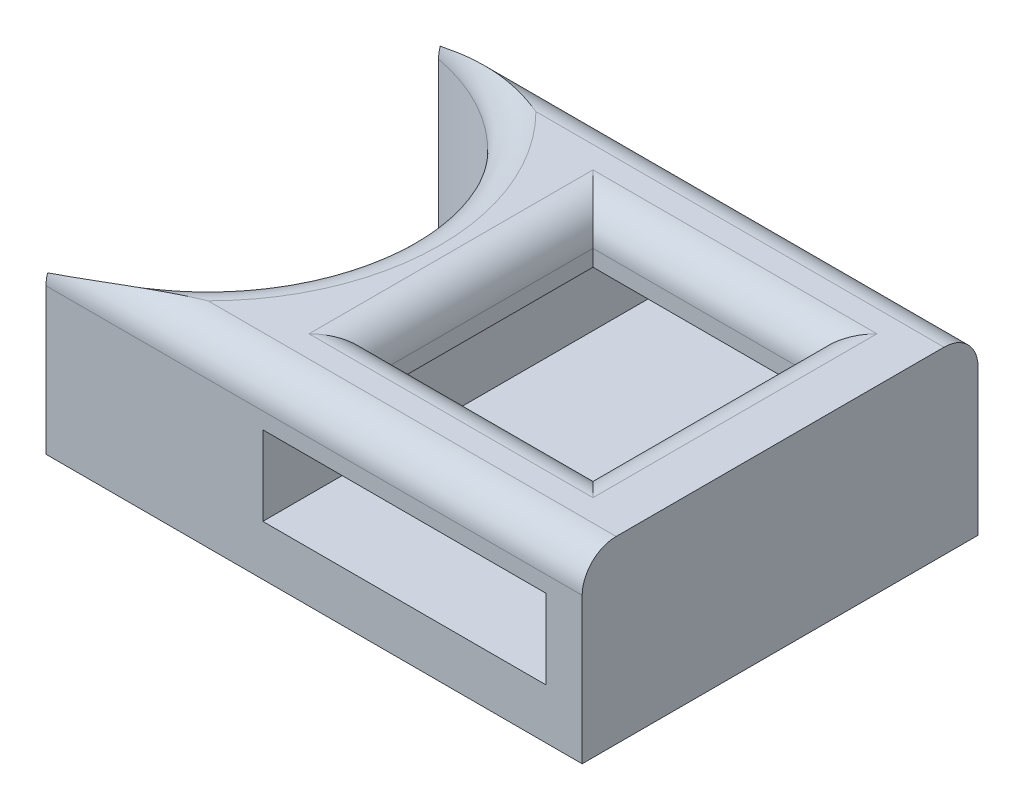
ISO-10303-21;
HEADER;
FILE_DESCRIPTION(('STEP AP214'),'2;1');
FILE_NAME('part.step','',(''),(''),'','','');
FILE_SCHEMA(('AUTOMOTIVE_DESIGN { 1 0 10303 214 1 1 1 1 }'));
ENDSEC;
DATA;
#1=APPLICATION_CONTEXT('core data for automotive mechanical design processes');
#2=APPLICATION_PROTOCOL_DEFINITION('international standard','automotive_design',2000,#1);
#3=PRODUCT_CONTEXT('',#1,'mechanical');
#4=PRODUCT('Part','Part','',(#3));
#5=PRODUCT_RELATED_PRODUCT_CATEGORY('part','',(#4));
#6=PRODUCT_DEFINITION_FORMATION('','',#4);
#7=PRODUCT_DEFINITION_CONTEXT('part definition',#1,'design');
#8=PRODUCT_DEFINITION('design','',#6,#7);
#9=PRODUCT_DEFINITION_SHAPE('','',#8);
#10=(LENGTH_UNIT() NAMED_UNIT(*) SI_UNIT(.MILLI.,.METRE.));
#11=(NAMED_UNIT(*) PLANE_ANGLE_UNIT() SI_UNIT($,.RADIAN.));
#12=(NAMED_UNIT(*) SI_UNIT($,.STERADIAN.) SOLID_ANGLE_UNIT());
#13=UNCERTAINTY_MEASURE_WITH_UNIT(LENGTH_MEASURE(1.E-05),#10,'distance_accuracy_value','');
#14=(GEOMETRIC_REPRESENTATION_CONTEXT(3) GLOBAL_UNCERTAINTY_ASSIGNED_CONTEXT((#13)) GLOBAL_UNIT_ASSIGNED_CONTEXT((#10,
#11,#12)) REPRESENTATION_CONTEXT('',''));
#15=CARTESIAN_POINT('',(0.,0.,0.));
#16=DIRECTION('',(0.,0.,1.));
#17=DIRECTION('',(1.,0.,0.));
#18=AXIS2_PLACEMENT_3D('',#15,#16,#17);
#19=CARTESIAN_POINT('',(-52.911658323012,15.875,-16.7284370179714));
#20=DIRECTION('',(0.,-1.,0.));
#21=DIRECTION('',(0.,0.,-1.));
#22=AXIS2_PLACEMENT_3D('',#19,#20,#21);
#23=CYLINDRICAL_SURFACE('',#22,17.4625);
#24=DIRECTION('',(0.,-1.,0.));
#25=VECTOR('',#24,1.);
#26=CARTESIAN_POINT('',(-49.736658323012,15.875,0.443000931425873));
#27=LINE('',#26,#25);
#28=CARTESIAN_POINT('',(-49.736658323012,0.,0.443000931425873));
#29=VERTEX_POINT('',#28);
#30=CARTESIAN_POINT('',(-49.736658323012,12.875,0.443000931425873));
#31=VERTEX_POINT('',#30);
#32=EDGE_CURVE('E342',#29,#31,#27,.F.);
#33=ORIENTED_EDGE('',*,*,#32,.T.);
#34=CARTESIAN_POINT('',(-52.911658323012,12.875,-16.7284370179714));
#35=DIRECTION('',(0.,-1.,0.));
#36=DIRECTION('',(0.,0.,-1.));
#37=AXIS2_PLACEMENT_3D('',#34,#35,#36);
#38=CIRCLE('',#37,17.4625);
#39=CARTESIAN_POINT('',(-49.736658323012,12.875,-33.8998749673686));
#40=VERTEX_POINT('',#39);
#41=EDGE_CURVE('E429',#31,#40,#38,.F.);
#42=ORIENTED_EDGE('',*,*,#41,.T.);
#43=DIRECTION('',(0.,-1.,0.));
#44=VECTOR('',#43,1.);
#45=CARTESIAN_POINT('',(-49.736658323012,15.875,-33.8998749673686));
#46=LINE('',#45,#44);
#47=CARTESIAN_POINT('',(-49.736658323012,0.,-33.8998749673686));
#48=VERTEX_POINT('',#47);
#49=EDGE_CURVE('E347',#40,#48,#46,.T.);
#50=ORIENTED_EDGE('',*,*,#49,.T.);
#51=CARTESIAN_POINT('',(-52.911658323012,0.,-16.7284370179714));
#52=DIRECTION('',(0.,-1.,0.));
#53=DIRECTION('',(0.,0.,-1.));
#54=AXIS2_PLACEMENT_3D('',#51,#52,#53);
#55=CIRCLE('',#54,17.4625);
#56=EDGE_CURVE('E349',#48,#29,#55,.T.);
#57=ORIENTED_EDGE('',*,*,#56,.T.);
#58=EDGE_LOOP('',(#33,#42,#50,#57));
#59=FACE_BOUND('',#58,.T.);
#60=ADVANCED_FACE('F32',(#59),#23,.F.);
#61=CARTESIAN_POINT('',(-52.911658323012,15.875,0.734062982028626));
#62=DIRECTION('',(0.,0.,-1.));
#63=DIRECTION('',(-1.,0.,0.));
#64=AXIS2_PLACEMENT_3D('',#61,#62,#63);
#65=PLANE('',#64);
#66=DIRECTION('',(1.,0.,0.));
#67=VECTOR('',#66,1.);
#68=CARTESIAN_POINT('',(-30.606658323012,11.4375,0.734062982028626));
#69=LINE('',#68,#67);
#70=CARTESIAN_POINT('',(-30.606658323012,11.4375,0.734062982028626));
#71=VERTEX_POINT('',#70);
#72=CARTESIAN_POINT('',(-5.60665832301203,11.4375,0.734062982028626));
#73=VERTEX_POINT('',#72);
#74=EDGE_CURVE('E298',#71,#73,#69,.T.);
#75=ORIENTED_EDGE('',*,*,#74,.T.);
#76=DIRECTION('',(0.,-1.,0.));
#77=VECTOR('',#76,1.);
#78=CARTESIAN_POINT('',(-5.60665832301203,4.4375,0.734062982028626));
#79=LINE('',#78,#77);
#80=CARTESIAN_POINT('',(-5.60665832301203,4.4375,0.734062982028626));
#81=VERTEX_POINT('',#80);
#82=EDGE_CURVE('E288',#73,#81,#79,.T.);
#83=ORIENTED_EDGE('',*,*,#82,.T.);
#84=DIRECTION('',(-1.,0.,0.));
#85=VECTOR('',#84,1.);
#86=CARTESIAN_POINT('',(-30.606658323012,4.4375,0.734062982028626));
#87=LINE('',#86,#85);
#88=CARTESIAN_POINT('',(-30.606658323012,4.4375,0.734062982028626));
#89=VERTEX_POINT('',#88);
#90=EDGE_CURVE('E291',#81,#89,#87,.T.);
#91=ORIENTED_EDGE('',*,*,#90,.T.);
#92=DIRECTION('',(0.,1.,0.));
#93=VECTOR('',#92,1.);
#94=CARTESIAN_POINT('',(-30.606658323012,4.4375,0.734062982028626));
#95=LINE('',#94,#93);
#96=EDGE_CURVE('E295',#89,#71,#95,.T.);
#97=ORIENTED_EDGE('',*,*,#96,.T.);
#98=EDGE_LOOP('',(#75,#83,#91,#97));
#99=FACE_BOUND('',#98,.T.);
#100=DIRECTION('',(0.,-1.,0.));
#101=VECTOR('',#100,1.);
#102=CARTESIAN_POINT('',(-2.43165832301204,15.875,0.734062982028626));
#103=LINE('',#102,#101);
#104=CARTESIAN_POINT('',(-2.43165832301204,12.875,0.734062982028626));
#105=VERTEX_POINT('',#104);
#106=CARTESIAN_POINT('',(-2.43165832301204,0.,0.734062982028626));
#107=VERTEX_POINT('',#106);
#108=EDGE_CURVE('E366',#105,#107,#103,.T.);
#109=ORIENTED_EDGE('',*,*,#108,.F.);
#110=DIRECTION('',(1.,0.,0.));
#111=VECTOR('',#110,1.);
#112=CARTESIAN_POINT('',(-52.911658323012,12.875,0.734062982028626));
#113=LINE('',#112,#111);
#114=CARTESIAN_POINT('',(-49.736658323012,12.875,0.734062982028626));
#115=VERTEX_POINT('',#114);
#116=EDGE_CURVE('E786',#105,#115,#113,.F.);
#117=ORIENTED_EDGE('',*,*,#116,.T.);
#118=DIRECTION('',(0.,1.,0.));
#119=VECTOR('',#118,1.);
#120=CARTESIAN_POINT('',(-49.736658323012,15.875,0.734062982028626));
#121=LINE('',#120,#119);
#122=CARTESIAN_POINT('',(-49.736658323012,0.,0.734062982028626));
#123=VERTEX_POINT('',#122);
#124=EDGE_CURVE('E333',#123,#115,#121,.T.);
#125=ORIENTED_EDGE('',*,*,#124,.F.);
#126=DIRECTION('',(1.,0.,0.));
#127=VECTOR('',#126,1.);
#128=CARTESIAN_POINT('',(-52.911658323012,0.,0.734062982028626));
#129=LINE('',#128,#127);
#130=EDGE_CURVE('E357',#123,#107,#129,.T.);
#131=ORIENTED_EDGE('',*,*,#130,.T.);
#132=EDGE_LOOP('',(#109,#117,#125,#131));
#133=FACE_BOUND('',#132,.T.);
#134=ADVANCED_FACE('F420',(#99,#133),#65,.F.);
#135=CARTESIAN_POINT('',(-2.43165832301204,15.875,-34.1909370179714));
#136=DIRECTION('',(-1.,0.,0.));
#137=DIRECTION('',(0.,0.,1.));
#138=AXIS2_PLACEMENT_3D('',#135,#136,#137);
#139=PLANE('',#138);
#140=DIRECTION('',(0.,-1.,0.));
#141=VECTOR('',#140,1.);
#142=CARTESIAN_POINT('',(-2.43165832301204,15.875,-34.1909370179714));
#143=LINE('',#142,#141);
#144=CARTESIAN_POINT('',(-2.43165832301204,12.875,-34.1909370179714));
#145=VERTEX_POINT('',#144);
#146=CARTESIAN_POINT('',(-2.43165832301204,0.,-34.1909370179714));
#147=VERTEX_POINT('',#146);
#148=EDGE_CURVE('E353',#145,#147,#143,.T.);
#149=ORIENTED_EDGE('',*,*,#148,.F.);
#150=CARTESIAN_POINT('',(-2.43165832301204,12.875,-31.1909370179714));
#151=DIRECTION('',(-1.,0.,0.));
#152=DIRECTION('',(0.,0.,1.));
#153=AXIS2_PLACEMENT_3D('',#150,#151,#152);
#154=CIRCLE('',#153,3.);
#155=CARTESIAN_POINT('',(-2.43165832301204,15.875,-31.1909370179714));
#156=VERTEX_POINT('',#155);
#157=EDGE_CURVE('E788',#145,#156,#154,.F.);
#158=ORIENTED_EDGE('',*,*,#157,.T.);
#159=DIRECTION('',(0.,0.,-1.));
#160=VECTOR('',#159,1.);
#161=CARTESIAN_POINT('',(-2.43165832301204,15.875,-34.1909370179714));
#162=LINE('',#161,#160);
#163=CARTESIAN_POINT('',(-2.43165832301204,15.875,-2.26593701797138));
#164=VERTEX_POINT('',#163);
#165=EDGE_CURVE('E350',#164,#156,#162,.T.);
#166=ORIENTED_EDGE('',*,*,#165,.F.);
#167=CARTESIAN_POINT('',(-2.43165832301204,12.875,-2.26593701797137));
#168=DIRECTION('',(-1.,0.,0.));
#169=DIRECTION('',(0.,0.,1.));
#170=AXIS2_PLACEMENT_3D('',#167,#168,#169);
#171=CIRCLE('',#170,3.);
#172=EDGE_CURVE('E790',#164,#105,#171,.F.);
#173=ORIENTED_EDGE('',*,*,#172,.T.);
#174=ORIENTED_EDGE('',*,*,#108,.T.);
#175=DIRECTION('',(0.,0.,-1.));
#176=VECTOR('',#175,1.);
#177=CARTESIAN_POINT('',(-2.43165832301204,0.,-34.1909370179714));
#178=LINE('',#177,#176);
#179=EDGE_CURVE('E360',#107,#147,#178,.T.);
#180=ORIENTED_EDGE('',*,*,#179,.T.);
#181=EDGE_LOOP('',(#149,#158,#166,#173,#174,#180));
#182=FACE_BOUND('',#181,.T.);
#183=ADVANCED_FACE('F416',(#182),#139,.F.);
#184=CARTESIAN_POINT('',(-52.911658323012,15.875,-34.1909370179714));
#185=DIRECTION('',(0.,0.,1.));
#186=DIRECTION('',(1.,0.,0.));
#187=AXIS2_PLACEMENT_3D('',#184,#185,#186);
#188=PLANE('',#187);
#189=DIRECTION('',(-1.,0.,0.));
#190=VECTOR('',#189,1.);
#191=CARTESIAN_POINT('',(-30.606658323012,4.4375,-34.1909370179714));
#192=LINE('',#191,#190);
#193=CARTESIAN_POINT('',(-5.60665832301203,4.4375,-34.1909370179714));
#194=VERTEX_POINT('',#193);
#195=CARTESIAN_POINT('',(-30.606658323012,4.4375,-34.1909370179714));
#196=VERTEX_POINT('',#195);
#197=EDGE_CURVE('E304',#194,#196,#192,.T.);
#198=ORIENTED_EDGE('',*,*,#197,.F.);
#199=DIRECTION('',(0.,-1.,0.));
#200=VECTOR('',#199,1.);
#201=CARTESIAN_POINT('',(-5.60665832301203,4.4375,-34.1909370179714));
#202=LINE('',#201,#200);
#203=CARTESIAN_POINT('',(-5.60665832301203,11.4375,-34.1909370179714));
#204=VERTEX_POINT('',#203);
#205=EDGE_CURVE('E302',#204,#194,#202,.T.);
#206=ORIENTED_EDGE('',*,*,#205,.F.);
#207=DIRECTION('',(1.,0.,0.));
#208=VECTOR('',#207,1.);
#209=CARTESIAN_POINT('',(-30.606658323012,11.4375,-34.1909370179714));
#210=LINE('',#209,#208);
#211=CARTESIAN_POINT('',(-30.606658323012,11.4375,-34.1909370179714));
#212=VERTEX_POINT('',#211);
#213=EDGE_CURVE('E292',#212,#204,#210,.T.);
#214=ORIENTED_EDGE('',*,*,#213,.F.);
#215=DIRECTION('',(0.,1.,0.));
#216=VECTOR('',#215,1.);
#217=CARTESIAN_POINT('',(-30.606658323012,4.4375,-34.1909370179714));
#218=LINE('',#217,#216);
#219=EDGE_CURVE('E308',#196,#212,#218,.T.);
#220=ORIENTED_EDGE('',*,*,#219,.F.);
#221=EDGE_LOOP('',(#198,#206,#214,#220));
#222=FACE_BOUND('',#221,.T.);
#223=DIRECTION('',(0.,-1.,0.));
#224=VECTOR('',#223,1.);
#225=CARTESIAN_POINT('',(-49.736658323012,15.875,-34.1909370179714));
#226=LINE('',#225,#224);
#227=CARTESIAN_POINT('',(-49.736658323012,12.875,-34.1909370179714));
#228=VERTEX_POINT('',#227);
#229=CARTESIAN_POINT('',(-49.736658323012,0.,-34.1909370179714));
#230=VERTEX_POINT('',#229);
#231=EDGE_CURVE('E345',#228,#230,#226,.T.);
#232=ORIENTED_EDGE('',*,*,#231,.F.);
#233=DIRECTION('',(-1.,0.,0.));
#234=VECTOR('',#233,1.);
#235=CARTESIAN_POINT('',(-52.911658323012,12.875,-34.1909370179714));
#236=LINE('',#235,#234);
#237=EDGE_CURVE('E796',#228,#145,#236,.F.);
#238=ORIENTED_EDGE('',*,*,#237,.T.);
#239=ORIENTED_EDGE('',*,*,#148,.T.);
#240=DIRECTION('',(-1.,0.,0.));
#241=VECTOR('',#240,1.);
#242=CARTESIAN_POINT('',(-52.911658323012,0.,-34.1909370179714));
#243=LINE('',#242,#241);
#244=EDGE_CURVE('E354',#147,#230,#243,.T.);
#245=ORIENTED_EDGE('',*,*,#244,.T.);
#246=EDGE_LOOP('',(#232,#238,#239,#245));
#247=FACE_BOUND('',#246,.T.);
#248=ADVANCED_FACE('F409',(#222,#247),#188,.F.);
#249=CARTESIAN_POINT('',(-52.911658323012,15.875,-16.7284370179714));
#250=DIRECTION('',(0.,-1.,0.));
#251=DIRECTION('',(0.,0.,-1.));
#252=AXIS2_PLACEMENT_3D('',#249,#250,#251);
#253=PLANE('',#252);
#254=DIRECTION('',(0.,0.,1.));
#255=VECTOR('',#254,1.);
#256=CARTESIAN_POINT('',(-31.465408323012,15.875,-16.7284370179714));
#257=LINE('',#256,#255);
#258=CARTESIAN_POINT('',(-31.465408323012,15.875,-4.20343701797138));
#259=VERTEX_POINT('',#258);
#260=CARTESIAN_POINT('',(-31.465408323012,15.875,-29.2534370179714));
#261=VERTEX_POINT('',#260);
#262=EDGE_CURVE('E444',#259,#261,#257,.F.);
#263=ORIENTED_EDGE('',*,*,#262,.T.);
#264=DIRECTION('',(-1.,0.,0.));
#265=VECTOR('',#264,1.);
#266=CARTESIAN_POINT('',(-52.911658323012,15.875,-29.2534370179714));
#267=LINE('',#266,#265);
#268=CARTESIAN_POINT('',(-6.41540832301203,15.875,-29.2534370179714));
#269=VERTEX_POINT('',#268);
#270=EDGE_CURVE('E502',#261,#269,#267,.F.);
#271=ORIENTED_EDGE('',*,*,#270,.T.);
#272=DIRECTION('',(0.,0.,-1.));
#273=VECTOR('',#272,1.);
#274=CARTESIAN_POINT('',(-6.41540832301203,15.875,-16.7284370179714));
#275=LINE('',#274,#273);
#276=CARTESIAN_POINT('',(-6.41540832301203,15.875,-4.20343701797138));
#277=VERTEX_POINT('',#276);
#278=EDGE_CURVE('E487',#269,#277,#275,.F.);
#279=ORIENTED_EDGE('',*,*,#278,.T.);
#280=DIRECTION('',(1.,0.,0.));
#281=VECTOR('',#280,1.);
#282=CARTESIAN_POINT('',(-52.911658323012,15.875,-4.20343701797138));
#283=LINE('',#282,#281);
#284=EDGE_CURVE('E505',#277,#259,#283,.F.);
#285=ORIENTED_EDGE('',*,*,#284,.T.);
#286=EDGE_LOOP('',(#263,#271,#279,#285));
#287=FACE_BOUND('',#286,.T.);
#288=ORIENTED_EDGE('',*,*,#165,.T.);
#289=DIRECTION('',(-1.,0.,0.));
#290=VECTOR('',#289,1.);
#291=CARTESIAN_POINT('',(-52.911658323012,15.875,-31.1909370179714));
#292=LINE('',#291,#290);
#293=CARTESIAN_POINT('',(-38.4358163785861,15.875,-31.1909370179714));
#294=VERTEX_POINT('',#293);
#295=EDGE_CURVE('E380',#156,#294,#292,.T.);
#296=ORIENTED_EDGE('',*,*,#295,.T.);
#297=CARTESIAN_POINT('',(-52.911658323012,15.875,-16.7284370179714));
#298=DIRECTION('',(0.,-1.,0.));
#299=DIRECTION('',(0.,0.,-1.));
#300=AXIS2_PLACEMENT_3D('',#297,#298,#299);
#301=CIRCLE('',#300,20.4625);
#302=CARTESIAN_POINT('',(-38.4358163785861,15.875,-2.26593701797137));
#303=VERTEX_POINT('',#302);
#304=EDGE_CURVE('E376',#294,#303,#301,.T.);
#305=ORIENTED_EDGE('',*,*,#304,.T.);
#306=DIRECTION('',(1.,0.,0.));
#307=VECTOR('',#306,1.);
#308=CARTESIAN_POINT('',(-52.911658323012,15.875,-2.26593701797137));
#309=LINE('',#308,#307);
#310=EDGE_CURVE('E378',#303,#164,#309,.T.);
#311=ORIENTED_EDGE('',*,*,#310,.T.);
#312=EDGE_LOOP('',(#288,#296,#305,#311));
#313=FACE_BOUND('',#312,.T.);
#314=ADVANCED_FACE('F406',(#287,#313),#253,.F.);
#315=CARTESIAN_POINT('',(-52.911658323012,0.,-16.7284370179714));
#316=DIRECTION('',(0.,-1.,0.));
#317=DIRECTION('',(0.,0.,-1.));
#318=AXIS2_PLACEMENT_3D('',#315,#316,#317);
#319=PLANE('',#318);
#320=DIRECTION('',(0.,0.,-1.));
#321=VECTOR('',#320,1.);
#322=CARTESIAN_POINT('',(-31.006658323012,0.,-8.79093701797138));
#323=LINE('',#322,#321);
#324=CARTESIAN_POINT('',(-31.006658323012,0.,-5.61593701797138));
#325=VERTEX_POINT('',#324);
#326=CARTESIAN_POINT('',(-31.006658323012,0.,-8.79093701797138));
#327=VERTEX_POINT('',#326);
#328=EDGE_CURVE('E220',#325,#327,#323,.T.);
#329=ORIENTED_EDGE('',*,*,#328,.F.);
#330=DIRECTION('',(-1.,0.,0.));
#331=VECTOR('',#330,1.);
#332=CARTESIAN_POINT('',(-31.006658323012,0.,-5.61593701797138));
#333=LINE('',#332,#331);
#334=CARTESIAN_POINT('',(-5.60665832301204,0.,-5.61593701797138));
#335=VERTEX_POINT('',#334);
#336=EDGE_CURVE('E237',#335,#325,#333,.T.);
#337=ORIENTED_EDGE('',*,*,#336,.F.);
#338=DIRECTION('',(0.,0.,1.));
#339=VECTOR('',#338,1.);
#340=CARTESIAN_POINT('',(-5.60665832301204,0.,-8.79093701797138));
#341=LINE('',#340,#339);
#342=CARTESIAN_POINT('',(-5.60665832301204,0.,-8.79093701797138));
#343=VERTEX_POINT('',#342);
#344=EDGE_CURVE('E240',#343,#335,#341,.T.);
#345=ORIENTED_EDGE('',*,*,#344,.F.);
#346=DIRECTION('',(1.,0.,0.));
#347=VECTOR('',#346,1.);
#348=CARTESIAN_POINT('',(-31.006658323012,0.,-8.79093701797138));
#349=LINE('',#348,#347);
#350=EDGE_CURVE('E246',#327,#343,#349,.T.);
#351=ORIENTED_EDGE('',*,*,#350,.F.);
#352=EDGE_LOOP('',(#329,#337,#345,#351));
#353=FACE_BOUND('',#352,.T.);
#354=DIRECTION('',(0.,0.,-1.));
#355=VECTOR('',#354,1.);
#356=CARTESIAN_POINT('',(-31.006658323012,0.,-27.8409370179714));
#357=LINE('',#356,#355);
#358=CARTESIAN_POINT('',(-31.006658323012,0.,-24.6659370179714));
#359=VERTEX_POINT('',#358);
#360=CARTESIAN_POINT('',(-31.006658323012,0.,-27.8409370179714));
#361=VERTEX_POINT('',#360);
#362=EDGE_CURVE('E252',#359,#361,#357,.T.);
#363=ORIENTED_EDGE('',*,*,#362,.F.);
#364=DIRECTION('',(-1.,0.,0.));
#365=VECTOR('',#364,1.);
#366=CARTESIAN_POINT('',(-31.006658323012,0.,-24.6659370179714));
#367=LINE('',#366,#365);
#368=CARTESIAN_POINT('',(-5.60665832301204,0.,-24.6659370179714));
#369=VERTEX_POINT('',#368);
#370=EDGE_CURVE('E260',#369,#359,#367,.T.);
#371=ORIENTED_EDGE('',*,*,#370,.F.);
#372=DIRECTION('',(0.,0.,1.));
#373=VECTOR('',#372,1.);
#374=CARTESIAN_POINT('',(-5.60665832301204,0.,-27.8409370179714));
#375=LINE('',#374,#373);
#376=CARTESIAN_POINT('',(-5.60665832301204,0.,-27.8409370179714));
#377=VERTEX_POINT('',#376);
#378=EDGE_CURVE('E274',#377,#369,#375,.T.);
#379=ORIENTED_EDGE('',*,*,#378,.F.);
#380=DIRECTION('',(1.,0.,0.));
#381=VECTOR('',#380,1.);
#382=CARTESIAN_POINT('',(-31.006658323012,0.,-27.8409370179714));
#383=LINE('',#382,#381);
#384=EDGE_CURVE('E271',#361,#377,#383,.T.);
#385=ORIENTED_EDGE('',*,*,#384,.F.);
#386=EDGE_LOOP('',(#363,#371,#379,#385));
#387=FACE_BOUND('',#386,.T.);
#388=DIRECTION('',(0.,0.,1.));
#389=VECTOR('',#388,1.);
#390=CARTESIAN_POINT('',(-49.736658323012,0.,-16.7284370179714));
#391=LINE('',#390,#389);
#392=EDGE_CURVE('E371',#29,#123,#391,.T.);
#393=ORIENTED_EDGE('',*,*,#392,.F.);
#394=ORIENTED_EDGE('',*,*,#56,.F.);
#395=DIRECTION('',(0.,0.,1.));
#396=VECTOR('',#395,1.);
#397=CARTESIAN_POINT('',(-49.736658323012,0.,-16.7284370179714));
#398=LINE('',#397,#396);
#399=EDGE_CURVE('E368',#230,#48,#398,.T.);
#400=ORIENTED_EDGE('',*,*,#399,.F.);
#401=ORIENTED_EDGE('',*,*,#244,.F.);
#402=ORIENTED_EDGE('',*,*,#179,.F.);
#403=ORIENTED_EDGE('',*,*,#130,.F.);
#404=EDGE_LOOP('',(#393,#394,#400,#401,#402,#403));
#405=FACE_BOUND('',#404,.T.);
#406=ADVANCED_FACE('F402',(#353,#387,#405),#319,.T.);
#407=CARTESIAN_POINT('',(-49.736658323012,15.875,-31.0159370179714));
#408=DIRECTION('',(1.,0.,0.));
#409=DIRECTION('',(0.,0.,-1.));
#410=AXIS2_PLACEMENT_3D('',#407,#408,#409);
#411=PLANE('',#410);
#412=CARTESIAN_POINT('',(-49.736658323012,12.875,-33.8998749673686));
#413=CARTESIAN_POINT('',(-49.736658323012,12.9590121376116,-33.8998642088698));
#414=CARTESIAN_POINT('',(-49.736658323012,13.0430238271397,-33.9034632714181));
#415=CARTESIAN_POINT('',(-49.736658323012,13.210439458699,-33.9178053676865));
#416=CARTESIAN_POINT('',(-49.736658323012,13.293843372297,-33.9285487334924));
#417=CARTESIAN_POINT('',(-49.736658323012,13.4579074746295,-33.956841422534));
#418=CARTESIAN_POINT('',(-49.736658323012,13.5385899191984,-33.9742620687563));
#419=CARTESIAN_POINT('',(-49.736658323012,13.6982087498148,-34.0157748945943));
#420=CARTESIAN_POINT('',(-49.736658323012,13.7771455042619,-34.0398656517992));
#421=CARTESIAN_POINT('',(-49.736658323012,13.9058578943895,-34.0850875962693));
#422=CARTESIAN_POINT('',(-49.736658323012,13.9562918427147,-34.1043687485018));
#423=CARTESIAN_POINT('',(-49.736658323012,14.0560180136408,-34.1456378258129));
#424=CARTESIAN_POINT('',(-49.736658323012,14.105310652416,-34.1676247451688));
#425=CARTESIAN_POINT('',(-49.736658323012,14.153974475794,-34.1909370179714));
#426=B_SPLINE_CURVE_WITH_KNOTS('',3,(#412,#413,#414,#415,#416,#417,#418,#419,#420,#421,#422,
#423,#424,#425),.UNSPECIFIED.,.F.,.F.,(4,2,2,2,2,2,4),(0.,0.251959521750185,0.503930756056007,
0.751272363647091,0.9985612658583,1.16046884624368,1.32231642699153),.UNSPECIFIED.);
#427=CARTESIAN_POINT('',(-49.736658323012,13.7942830648423,-34.0466188361532));
#428=VERTEX_POINT('',#427);
#429=EDGE_CURVE('E383',#40,#428,#426,.T.);
#430=ORIENTED_EDGE('',*,*,#429,.T.);
#431=CARTESIAN_POINT('',(-49.736658323012,12.875,-31.1909370179714));
#432=DIRECTION('',(1.,0.,0.));
#433=DIRECTION('',(0.,0.,-1.));
#434=AXIS2_PLACEMENT_3D('',#431,#432,#433);
#435=CIRCLE('',#434,3.);
#436=EDGE_CURVE('E390',#428,#228,#435,.F.);
#437=ORIENTED_EDGE('',*,*,#436,.T.);
#438=ORIENTED_EDGE('',*,*,#231,.T.);
#439=ORIENTED_EDGE('',*,*,#399,.T.);
#440=ORIENTED_EDGE('',*,*,#49,.F.);
#441=EDGE_LOOP('',(#430,#437,#438,#439,#440));
#442=FACE_BOUND('',#441,.T.);
#443=ADVANCED_FACE('F396',(#442),#411,.F.);
#444=CARTESIAN_POINT('',(-49.736658323012,15.875,-2.44093701797137));
#445=DIRECTION('',(1.,0.,0.));
#446=DIRECTION('',(0.,0.,-1.));
#447=AXIS2_PLACEMENT_3D('',#444,#445,#446);
#448=PLANE('',#447);
#449=ORIENTED_EDGE('',*,*,#124,.T.);
#450=CARTESIAN_POINT('',(-49.736658323012,12.875,-2.26593701797137));
#451=DIRECTION('',(1.,0.,0.));
#452=DIRECTION('',(0.,0.,-1.));
#453=AXIS2_PLACEMENT_3D('',#450,#451,#452);
#454=CIRCLE('',#453,3.);
#455=CARTESIAN_POINT('',(-49.736658323012,13.7942830648423,0.589744800210445));
#456=VERTEX_POINT('',#455);
#457=EDGE_CURVE('E441',#115,#456,#454,.F.);
#458=ORIENTED_EDGE('',*,*,#457,.T.);
#459=CARTESIAN_POINT('',(-49.736658323012,14.153974475794,0.734062982028626));
#460=CARTESIAN_POINT('',(-49.736658323012,14.0782289363903,0.697767398081702));
#461=CARTESIAN_POINT('',(-49.736658323012,14.0009390749234,0.66469038531239));
#462=CARTESIAN_POINT('',(-49.736658323012,13.8437964680519,0.605178354667754));
#463=CARTESIAN_POINT('',(-49.736658323012,13.7639423882463,0.578746860375233));
#464=CARTESIAN_POINT('',(-49.736658323012,13.6037710749094,0.533194096597435));
#465=CARTESIAN_POINT('',(-49.736658323012,13.5234896224704,0.513946851685435));
#466=CARTESIAN_POINT('',(-49.736658323012,13.3616405122634,0.482240947671387));
#467=CARTESIAN_POINT('',(-49.736658323012,13.2800736745398,0.469778127397233));
#468=CARTESIAN_POINT('',(-49.736658323012,13.1446614983487,0.454858120043603));
#469=CARTESIAN_POINT('',(-49.736658323012,13.0910255375712,0.45042926957431));
#470=CARTESIAN_POINT('',(-49.736658323012,12.983262413584,0.444491164443433));
#471=CARTESIAN_POINT('',(-49.736658323012,12.9291342547725,0.442999973253934));
#472=CARTESIAN_POINT('',(-49.736658323012,12.875,0.443000931425869));
#473=B_SPLINE_CURVE_WITH_KNOTS('',3,(#459,#460,#461,#462,#463,#464,#465,#466,#467,#468,#469,
#470,#471,#472),.UNSPECIFIED.,.F.,.F.,(4,2,2,2,2,2,4),(0.,0.251906652306582,0.503946590064093,
0.75133244690256,0.998566400174459,1.15994725209768,1.32231736469889),.UNSPECIFIED.);
#474=EDGE_CURVE('E438',#456,#31,#473,.T.);
#475=ORIENTED_EDGE('',*,*,#474,.T.);
#476=ORIENTED_EDGE('',*,*,#32,.F.);
#477=ORIENTED_EDGE('',*,*,#392,.T.);
#478=EDGE_LOOP('',(#449,#458,#475,#476,#477));
#479=FACE_BOUND('',#478,.T.);
#480=ADVANCED_FACE('F401',(#479),#448,.F.);
#481=CARTESIAN_POINT('',(-9.41540832301203,5.875,-7.20343701797138));
#482=DIRECTION('',(1.,0.,0.));
#483=DIRECTION('',(0.,0.,-1.));
#484=AXIS2_PLACEMENT_3D('',#481,#482,#483);
#485=PLANE('',#484);
#486=DIRECTION('',(0.,1.,0.));
#487=VECTOR('',#486,1.);
#488=CARTESIAN_POINT('',(-9.41540832301203,5.875,-7.20343701797138));
#489=LINE('',#488,#487);
#490=CARTESIAN_POINT('',(-9.41540832301204,11.4375,-7.20343701797138));
#491=VERTEX_POINT('',#490);
#492=CARTESIAN_POINT('',(-9.41540832301203,12.875,-7.20343701797138));
#493=VERTEX_POINT('',#492);
#494=EDGE_CURVE('E331',#491,#493,#489,.T.);
#495=ORIENTED_EDGE('',*,*,#494,.T.);
#496=DIRECTION('',(0.,0.,-1.));
#497=VECTOR('',#496,1.);
#498=CARTESIAN_POINT('',(-9.41540832301203,12.875,-7.20343701797138));
#499=LINE('',#498,#497);
#500=CARTESIAN_POINT('',(-9.41540832301203,12.875,-26.2534370179714));
#501=VERTEX_POINT('',#500);
#502=EDGE_CURVE('E489',#493,#501,#499,.T.);
#503=ORIENTED_EDGE('',*,*,#502,.T.);
#504=DIRECTION('',(0.,1.,0.));
#505=VECTOR('',#504,1.);
#506=CARTESIAN_POINT('',(-9.41540832301203,5.875,-26.2534370179714));
#507=LINE('',#506,#505);
#508=CARTESIAN_POINT('',(-9.41540832301203,11.4375,-26.2534370179714));
#509=VERTEX_POINT('',#508);
#510=EDGE_CURVE('E330',#509,#501,#507,.T.);
#511=ORIENTED_EDGE('',*,*,#510,.F.);
#512=DIRECTION('',(0.,0.,1.));
#513=VECTOR('',#512,1.);
#514=CARTESIAN_POINT('',(-9.41540832301203,11.4375,-7.20343701797138));
#515=LINE('',#514,#513);
#516=EDGE_CURVE('E327',#509,#491,#515,.T.);
#517=ORIENTED_EDGE('',*,*,#516,.T.);
#518=EDGE_LOOP('',(#495,#503,#511,#517));
#519=FACE_BOUND('',#518,.T.);
#520=ADVANCED_FACE('F520',(#519),#485,.F.);
#521=CARTESIAN_POINT('',(-28.465408323012,5.875,-7.20343701797138));
#522=DIRECTION('',(0.,0.,1.));
#523=DIRECTION('',(1.,0.,0.));
#524=AXIS2_PLACEMENT_3D('',#521,#522,#523);
#525=PLANE('',#524);
#526=DIRECTION('',(0.,1.,0.));
#527=VECTOR('',#526,1.);
#528=CARTESIAN_POINT('',(-28.465408323012,5.875,-7.20343701797138));
#529=LINE('',#528,#527);
#530=CARTESIAN_POINT('',(-28.465408323012,11.4375,-7.20343701797138));
#531=VERTEX_POINT('',#530);
#532=CARTESIAN_POINT('',(-28.465408323012,12.875,-7.20343701797138));
#533=VERTEX_POINT('',#532);
#534=EDGE_CURVE('E334',#531,#533,#529,.T.);
#535=ORIENTED_EDGE('',*,*,#534,.T.);
#536=DIRECTION('',(1.,0.,0.));
#537=VECTOR('',#536,1.);
#538=CARTESIAN_POINT('',(-28.465408323012,12.875,-7.20343701797138));
#539=LINE('',#538,#537);
#540=EDGE_CURVE('E41',#533,#493,#539,.T.);
#541=ORIENTED_EDGE('',*,*,#540,.T.);
#542=ORIENTED_EDGE('',*,*,#494,.F.);
#543=DIRECTION('',(-1.,0.,0.));
#544=VECTOR('',#543,1.);
#545=CARTESIAN_POINT('',(-28.465408323012,11.4375,-7.20343701797138));
#546=LINE('',#545,#544);
#547=EDGE_CURVE('E324',#491,#531,#546,.T.);
#548=ORIENTED_EDGE('',*,*,#547,.T.);
#549=EDGE_LOOP('',(#535,#541,#542,#548));
#550=FACE_BOUND('',#549,.T.);
#551=ADVANCED_FACE('F518',(#550),#525,.F.);
#552=CARTESIAN_POINT('',(-28.465408323012,5.875,-7.20343701797138));
#553=DIRECTION('',(-1.,0.,0.));
#554=DIRECTION('',(0.,0.,1.));
#555=AXIS2_PLACEMENT_3D('',#552,#553,#554);
#556=PLANE('',#555);
#557=DIRECTION('',(0.,1.,0.));
#558=VECTOR('',#557,1.);
#559=CARTESIAN_POINT('',(-28.465408323012,5.875,-26.2534370179714));
#560=LINE('',#559,#558);
#561=CARTESIAN_POINT('',(-28.465408323012,11.4375,-26.2534370179714));
#562=VERTEX_POINT('',#561);
#563=CARTESIAN_POINT('',(-28.465408323012,12.875,-26.2534370179714));
#564=VERTEX_POINT('',#563);
#565=EDGE_CURVE('E336',#562,#564,#560,.T.);
#566=ORIENTED_EDGE('',*,*,#565,.T.);
#567=DIRECTION('',(0.,0.,1.));
#568=VECTOR('',#567,1.);
#569=CARTESIAN_POINT('',(-28.465408323012,12.875,-7.20343701797138));
#570=LINE('',#569,#568);
#571=EDGE_CURVE('E11',#564,#533,#570,.T.);
#572=ORIENTED_EDGE('',*,*,#571,.T.);
#573=ORIENTED_EDGE('',*,*,#534,.F.);
#574=DIRECTION('',(0.,0.,-1.));
#575=VECTOR('',#574,1.);
#576=CARTESIAN_POINT('',(-28.465408323012,11.4375,-7.20343701797138));
#577=LINE('',#576,#575);
#578=EDGE_CURVE('E315',#531,#562,#577,.T.);
#579=ORIENTED_EDGE('',*,*,#578,.T.);
#580=EDGE_LOOP('',(#566,#572,#573,#579));
#581=FACE_BOUND('',#580,.T.);
#582=ADVANCED_FACE('F515',(#581),#556,.F.);
#583=CARTESIAN_POINT('',(-28.465408323012,5.875,-26.2534370179714));
#584=DIRECTION('',(0.,0.,-1.));
#585=DIRECTION('',(-1.,0.,0.));
#586=AXIS2_PLACEMENT_3D('',#583,#584,#585);
#587=PLANE('',#586);
#588=ORIENTED_EDGE('',*,*,#510,.T.);
#589=DIRECTION('',(-1.,0.,0.));
#590=VECTOR('',#589,1.);
#591=CARTESIAN_POINT('',(-28.465408323012,12.875,-26.2534370179714));
#592=LINE('',#591,#590);
#593=EDGE_CURVE('E440',#501,#564,#592,.T.);
#594=ORIENTED_EDGE('',*,*,#593,.T.);
#595=ORIENTED_EDGE('',*,*,#565,.F.);
#596=DIRECTION('',(1.,0.,0.));
#597=VECTOR('',#596,1.);
#598=CARTESIAN_POINT('',(-28.465408323012,11.4375,-26.2534370179714));
#599=LINE('',#598,#597);
#600=EDGE_CURVE('E373',#562,#509,#599,.T.);
#601=ORIENTED_EDGE('',*,*,#600,.T.);
#602=EDGE_LOOP('',(#588,#594,#595,#601));
#603=FACE_BOUND('',#602,.T.);
#604=ADVANCED_FACE('F513',(#603),#587,.F.);
#605=CARTESIAN_POINT('',(-30.606658323012,11.4375,0.734062982028626));
#606=DIRECTION('',(0.,1.,0.));
#607=DIRECTION('',(-1.,0.,0.));
#608=AXIS2_PLACEMENT_3D('',#605,#606,#607);
#609=PLANE('',#608);
#610=ORIENTED_EDGE('',*,*,#213,.T.);
#611=DIRECTION('',(0.,0.,-1.));
#612=VECTOR('',#611,1.);
#613=CARTESIAN_POINT('',(-5.60665832301203,11.4375,0.734062982028626));
#614=LINE('',#613,#612);
#615=EDGE_CURVE('E313',#73,#204,#614,.T.);
#616=ORIENTED_EDGE('',*,*,#615,.F.);
#617=ORIENTED_EDGE('',*,*,#74,.F.);
#618=DIRECTION('',(0.,0.,-1.));
#619=VECTOR('',#618,1.);
#620=CARTESIAN_POINT('',(-30.606658323012,11.4375,0.734062982028626));
#621=LINE('',#620,#619);
#622=EDGE_CURVE('E316',#71,#212,#621,.T.);
#623=ORIENTED_EDGE('',*,*,#622,.T.);
#624=EDGE_LOOP('',(#610,#616,#617,#623));
#625=FACE_BOUND('',#624,.T.);
#626=ORIENTED_EDGE('',*,*,#600,.F.);
#627=ORIENTED_EDGE('',*,*,#578,.F.);
#628=ORIENTED_EDGE('',*,*,#547,.F.);
#629=ORIENTED_EDGE('',*,*,#516,.F.);
#630=EDGE_LOOP('',(#626,#627,#628,#629));
#631=FACE_BOUND('',#630,.T.);
#632=ADVANCED_FACE('F517',(#625,#631),#609,.F.);
#633=CARTESIAN_POINT('',(-5.60665832301203,4.4375,0.734062982028626));
#634=DIRECTION('',(1.,0.,0.));
#635=DIRECTION('',(0.,0.,-1.));
#636=AXIS2_PLACEMENT_3D('',#633,#634,#635);
#637=PLANE('',#636);
#638=ORIENTED_EDGE('',*,*,#205,.T.);
#639=DIRECTION('',(0.,0.,-1.));
#640=VECTOR('',#639,1.);
#641=CARTESIAN_POINT('',(-5.60665832301203,4.4375,0.734062982028626));
#642=LINE('',#641,#640);
#643=EDGE_CURVE('E301',#81,#194,#642,.T.);
#644=ORIENTED_EDGE('',*,*,#643,.F.);
#645=ORIENTED_EDGE('',*,*,#82,.F.);
#646=ORIENTED_EDGE('',*,*,#615,.T.);
#647=EDGE_LOOP('',(#638,#644,#645,#646));
#648=FACE_BOUND('',#647,.T.);
#649=ADVANCED_FACE('F532',(#648),#637,.F.);
#650=CARTESIAN_POINT('',(-30.606658323012,4.4375,0.734062982028626));
#651=DIRECTION('',(-1.,0.,0.));
#652=DIRECTION('',(0.,0.,1.));
#653=AXIS2_PLACEMENT_3D('',#650,#651,#652);
#654=PLANE('',#653);
#655=ORIENTED_EDGE('',*,*,#219,.T.);
#656=ORIENTED_EDGE('',*,*,#622,.F.);
#657=ORIENTED_EDGE('',*,*,#96,.F.);
#658=DIRECTION('',(0.,0.,-1.));
#659=VECTOR('',#658,1.);
#660=CARTESIAN_POINT('',(-30.606658323012,4.4375,0.734062982028626));
#661=LINE('',#660,#659);
#662=EDGE_CURVE('E318',#89,#196,#661,.T.);
#663=ORIENTED_EDGE('',*,*,#662,.T.);
#664=EDGE_LOOP('',(#655,#656,#657,#663));
#665=FACE_BOUND('',#664,.T.);
#666=ADVANCED_FACE('F535',(#665),#654,.F.);
#667=CARTESIAN_POINT('',(-30.606658323012,4.4375,0.734062982028626));
#668=DIRECTION('',(0.,-1.,0.));
#669=DIRECTION('',(1.,0.,0.));
#670=AXIS2_PLACEMENT_3D('',#667,#668,#669);
#671=PLANE('',#670);
#672=ORIENTED_EDGE('',*,*,#197,.T.);
#673=ORIENTED_EDGE('',*,*,#662,.F.);
#674=ORIENTED_EDGE('',*,*,#90,.F.);
#675=ORIENTED_EDGE('',*,*,#643,.T.);
#676=EDGE_LOOP('',(#672,#673,#674,#675));
#677=FACE_BOUND('',#676,.T.);
#678=ADVANCED_FACE('F466',(#677),#671,.F.);
#679=CARTESIAN_POINT('',(-52.911658323012,12.875,-2.26593701797137));
#680=DIRECTION('',(1.,0.,0.));
#681=DIRECTION('',(0.,0.,-1.));
#682=AXIS2_PLACEMENT_3D('',#679,#680,#681);
#683=CYLINDRICAL_SURFACE('',#682,3.);
#684=ORIENTED_EDGE('',*,*,#172,.F.);
#685=ORIENTED_EDGE('',*,*,#310,.F.);
#686=CARTESIAN_POINT('',(-38.4358163785861,15.875,-2.26593701797137));
#687=CARTESIAN_POINT('',(-38.4398268915737,15.8749999973587,-2.2642747253457));
#688=CARTESIAN_POINT('',(-38.4438376560484,15.8749986158373,-2.26261301981211));
#689=CARTESIAN_POINT('',(-38.6811794721253,15.8748354336229,-2.16432051226136));
#690=CARTESIAN_POINT('',(-38.9153580138185,15.870017839651,-2.06967795952033));
#691=CARTESIAN_POINT('',(-39.3850683461191,15.8521157800611,-1.88459757735539));
#692=CARTESIAN_POINT('',(-39.6206003708722,15.8390298386197,-1.79416050166469));
#693=CARTESIAN_POINT('',(-40.3291393893277,15.7887162030769,-1.5293116785407));
#694=CARTESIAN_POINT('',(-40.8038550356899,15.7404347450753,-1.36145951863672));
#695=CARTESIAN_POINT('',(-41.7569147101047,15.6201400818787,-1.04404434957458));
#696=CARTESIAN_POINT('',(-42.2352625729781,15.5480968888198,-0.894504780038443));
#697=CARTESIAN_POINT('',(-43.1940684738196,15.3848242843983,-0.614567885449159));
#698=CARTESIAN_POINT('',(-43.6745256002934,15.293602488665,-0.484162997003272));
#699=CARTESIAN_POINT('',(-44.3092479040644,15.1630925217476,-0.325033516951274));
#700=CARTESIAN_POINT('',(-44.4628141929089,15.1307467017218,-0.287545585243305));
#701=CARTESIAN_POINT('',(-44.7700249312071,15.0646009864174,-0.214578588246393));
#702=CARTESIAN_POINT('',(-44.9236692998367,15.0308018475703,-0.179098499653759));
#703=CARTESIAN_POINT('',(-45.5561594064608,14.8889254737749,-0.0372208041311444));
#704=CARTESIAN_POINT('',(-46.0356615797475,14.7749113123329,0.060491400245036));
#705=CARTESIAN_POINT('',(-46.9957533097058,14.5365215858144,0.236319241733557));
#706=CARTESIAN_POINT('',(-47.4763430864609,14.4121436987749,0.314430471493062));
#707=CARTESIAN_POINT('',(-48.4384773251307,14.1555601689844,0.450915982324568));
#708=CARTESIAN_POINT('',(-48.9200221315586,14.0233508442941,0.509280891746095));
#709=CARTESIAN_POINT('',(-49.8836001155903,13.7535481651322,0.606117016165123));
#710=CARTESIAN_POINT('',(-50.3656332890914,13.615954855531,0.644588396918053));
#711=CARTESIAN_POINT('',(-51.1875086972499,13.3787633666785,0.693157312434816));
#712=CARTESIAN_POINT('',(-51.5272909830966,13.2799480925765,0.708279438966774));
#713=CARTESIAN_POINT('',(-52.206820439076,13.0815673234481,0.728602584953147));
#714=CARTESIAN_POINT('',(-52.5465675804705,12.9820021006895,0.733807045731019));
#715=CARTESIAN_POINT('',(-52.8947501345597,12.8799555229763,0.734059912850146));
#716=CARTESIAN_POINT('',(-52.9032042350387,12.8774777596078,0.734062982517788));
#717=CARTESIAN_POINT('',(-52.911658323012,12.875,0.734062982028626));
#718=B_SPLINE_CURVE_WITH_KNOTS('',3,(#686,#687,#688,#689,#690,#691,#692,#693,#694,#695,#696,
#697,#698,#699,#700,#701,#702,#703,#704,#705,#706,#707,#708,#709,#710,#711,#712,#713,#714,#715,
#716,#717),.UNSPECIFIED.,.F.,.F.,(4,2,2,2,2,2,2,2,2,2,2,2,2,2,2,4),(0.,0.0130241107209163,
0.770669294947276,1.52844975004471,3.04476995237932,4.56301115552004,6.08065061526782,
6.56469285448648,7.04848613618449,8.55529153755661,10.0624354468051,11.570293649992,
13.0781392893088,14.1405633268693,15.2026186475293,15.2290477997066),.UNSPECIFIED.);
#719=EDGE_CURVE('E305',#456,#303,#718,.F.);
#720=ORIENTED_EDGE('',*,*,#719,.F.);
#721=ORIENTED_EDGE('',*,*,#457,.F.);
#722=ORIENTED_EDGE('',*,*,#116,.F.);
#723=EDGE_LOOP('',(#684,#685,#720,#721,#722));
#724=FACE_BOUND('',#723,.T.);
#725=ADVANCED_FACE('F462',(#724),#683,.T.);
#726=CARTESIAN_POINT('',(-52.911658323012,12.875,-16.7284370179714));
#727=DIRECTION('',(0.,-1.,0.));
#728=DIRECTION('',(0.,0.,-1.));
#729=AXIS2_PLACEMENT_3D('',#726,#727,#728);
#730=TOROIDAL_SURFACE('',#729,20.4625,3.);
#731=ORIENTED_EDGE('',*,*,#719,.T.);
#732=ORIENTED_EDGE('',*,*,#304,.F.);
#733=CARTESIAN_POINT('',(-38.4358163785861,15.875,-31.1909370179714));
#734=CARTESIAN_POINT('',(-38.4398268915737,15.8749999973587,-31.1925993105971));
#735=CARTESIAN_POINT('',(-38.4438376560484,15.8749986158373,-31.1942610161307));
#736=CARTESIAN_POINT('',(-38.6811794721241,15.8748354336229,-31.2925535236837));
#737=CARTESIAN_POINT('',(-38.9153580138178,15.870017839651,-31.3871960764229));
#738=CARTESIAN_POINT('',(-39.3850683461184,15.8521157800612,-31.5722764585863));
#739=CARTESIAN_POINT('',(-39.6206003708711,15.8390298386198,-31.6627135342774));
#740=CARTESIAN_POINT('',(-40.3291393893257,15.788716203077,-31.9275623574018));
#741=CARTESIAN_POINT('',(-40.8038550356877,15.7404347450756,-32.0954145173054));
#742=CARTESIAN_POINT('',(-41.756914710102,15.6201400818791,-32.4128296863672));
#743=CARTESIAN_POINT('',(-42.2352625729752,15.5480968888203,-32.5623692559033));
#744=CARTESIAN_POINT('',(-43.1940684738161,15.384824284399,-32.8423061504926));
#745=CARTESIAN_POINT('',(-43.6745256002896,15.2936024886657,-32.9727110389385));
#746=CARTESIAN_POINT('',(-44.309247904061,15.1630925217483,-33.1318405189906));
#747=CARTESIAN_POINT('',(-44.4628141929062,15.1307467017224,-33.1693284506988));
#748=CARTESIAN_POINT('',(-44.7700249312057,15.0646009864177,-33.242295447696));
#749=CARTESIAN_POINT('',(-44.923669299836,15.0308018475705,-33.2777755362888));
#750=CARTESIAN_POINT('',(-45.5561594064607,14.8889254737749,-33.4196532318116));
#751=CARTESIAN_POINT('',(-46.0356615797475,14.7749113123329,-33.5173654361878));
#752=CARTESIAN_POINT('',(-46.9957533097057,14.5365215858144,-33.6931932776763));
#753=CARTESIAN_POINT('',(-47.4763430864608,14.4121436987749,-33.7713045074358));
#754=CARTESIAN_POINT('',(-48.4384773251306,14.1555601689844,-33.9077900182673));
#755=CARTESIAN_POINT('',(-48.9200221315585,14.023350844294,-33.9661549276888));
#756=CARTESIAN_POINT('',(-49.8836001155903,13.7535481651323,-34.0629910521079));
#757=CARTESIAN_POINT('',(-50.3656332890915,13.6159548555313,-34.1014624328608));
#758=CARTESIAN_POINT('',(-51.1875086972498,13.3787633666782,-34.1500313483776));
#759=CARTESIAN_POINT('',(-51.5272909830964,13.2799480925759,-34.1651534749095));
#760=CARTESIAN_POINT('',(-52.2068204390762,13.0815673234488,-34.1854766208959));
#761=CARTESIAN_POINT('',(-52.5465675804712,12.982002100692,-34.1906810816738));
#762=CARTESIAN_POINT('',(-52.8947501345598,12.8799555229764,-34.1909339487929));
#763=CARTESIAN_POINT('',(-52.9032042350387,12.8774777596078,-34.1909370184605));
#764=CARTESIAN_POINT('',(-52.911658323012,12.875,-34.1909370179714));
#765=B_SPLINE_CURVE_WITH_KNOTS('',3,(#733,#734,#735,#736,#737,#738,#739,#740,#741,#742,#743,
#744,#745,#746,#747,#748,#749,#750,#751,#752,#753,#754,#755,#756,#757,#758,#759,#760,#761,#762,
#763,#764),.UNSPECIFIED.,.F.,.F.,(4,2,2,2,2,2,2,2,2,2,2,2,2,2,2,4),(0.,0.0130241107209179,
0.770669294946466,1.52844975004319,3.04476995237658,4.56301115551664,6.08065061526355,
6.56469285448439,7.0484861361845,8.55529153755655,10.062435446805,11.570293649992,
13.0781392893088,14.1405633268694,15.2026186475293,15.2290477997066),.UNSPECIFIED.);
#766=EDGE_CURVE('E281',#428,#294,#765,.F.);
#767=ORIENTED_EDGE('',*,*,#766,.F.);
#768=ORIENTED_EDGE('',*,*,#429,.F.);
#769=ORIENTED_EDGE('',*,*,#41,.F.);
#770=ORIENTED_EDGE('',*,*,#474,.F.);
#771=EDGE_LOOP('',(#731,#732,#767,#768,#769,#770));
#772=FACE_BOUND('',#771,.T.);
#773=ADVANCED_FACE('F392',(#772),#730,.T.);
#774=CARTESIAN_POINT('',(-52.911658323012,12.875,-31.1909370179714));
#775=DIRECTION('',(-1.,0.,0.));
#776=DIRECTION('',(0.,0.,1.));
#777=AXIS2_PLACEMENT_3D('',#774,#775,#776);
#778=CYLINDRICAL_SURFACE('',#777,3.);
#779=ORIENTED_EDGE('',*,*,#157,.F.);
#780=ORIENTED_EDGE('',*,*,#237,.F.);
#781=ORIENTED_EDGE('',*,*,#436,.F.);
#782=ORIENTED_EDGE('',*,*,#766,.T.);
#783=ORIENTED_EDGE('',*,*,#295,.F.);
#784=EDGE_LOOP('',(#779,#780,#781,#782,#783));
#785=FACE_BOUND('',#784,.T.);
#786=ADVANCED_FACE('F457',(#785),#778,.T.);
#787=CARTESIAN_POINT('',(-31.006658323012,4.175,-27.8409370179714));
#788=DIRECTION('',(-1.,0.,0.));
#789=DIRECTION('',(0.,0.,1.));
#790=AXIS2_PLACEMENT_3D('',#787,#788,#789);
#791=PLANE('',#790);
#792=ORIENTED_EDGE('',*,*,#362,.T.);
#793=DIRECTION('',(0.,-1.,0.));
#794=VECTOR('',#793,1.);
#795=CARTESIAN_POINT('',(-31.006658323012,4.175,-27.8409370179714));
#796=LINE('',#795,#794);
#797=CARTESIAN_POINT('',(-31.006658323012,4.175,-27.8409370179714));
#798=VERTEX_POINT('',#797);
#799=EDGE_CURVE('E269',#798,#361,#796,.T.);
#800=ORIENTED_EDGE('',*,*,#799,.F.);
#801=DIRECTION('',(0.,0.,-1.));
#802=VECTOR('',#801,1.);
#803=CARTESIAN_POINT('',(-31.006658323012,4.175,-27.8409370179714));
#804=LINE('',#803,#802);
#805=CARTESIAN_POINT('',(-31.006658323012,4.175,-24.6659370179714));
#806=VERTEX_POINT('',#805);
#807=EDGE_CURVE('E256',#806,#798,#804,.T.);
#808=ORIENTED_EDGE('',*,*,#807,.F.);
#809=DIRECTION('',(0.,-1.,0.));
#810=VECTOR('',#809,1.);
#811=CARTESIAN_POINT('',(-31.006658323012,4.175,-24.6659370179714));
#812=LINE('',#811,#810);
#813=EDGE_CURVE('E279',#806,#359,#812,.T.);
#814=ORIENTED_EDGE('',*,*,#813,.T.);
#815=EDGE_LOOP('',(#792,#800,#808,#814));
#816=FACE_BOUND('',#815,.T.);
#817=ADVANCED_FACE('F460',(#816),#791,.F.);
#818=CARTESIAN_POINT('',(-31.006658323012,4.175,-24.6659370179714));
#819=DIRECTION('',(0.,0.,1.));
#820=DIRECTION('',(1.,0.,0.));
#821=AXIS2_PLACEMENT_3D('',#818,#819,#820);
#822=PLANE('',#821);
#823=ORIENTED_EDGE('',*,*,#370,.T.);
#824=ORIENTED_EDGE('',*,*,#813,.F.);
#825=DIRECTION('',(-1.,0.,0.));
#826=VECTOR('',#825,1.);
#827=CARTESIAN_POINT('',(-31.006658323012,4.175,-24.6659370179714));
#828=LINE('',#827,#826);
#829=CARTESIAN_POINT('',(-5.60665832301204,4.175,-24.6659370179714));
#830=VERTEX_POINT('',#829);
#831=EDGE_CURVE('E266',#830,#806,#828,.T.);
#832=ORIENTED_EDGE('',*,*,#831,.F.);
#833=DIRECTION('',(0.,-1.,0.));
#834=VECTOR('',#833,1.);
#835=CARTESIAN_POINT('',(-5.60665832301204,4.175,-24.6659370179714));
#836=LINE('',#835,#834);
#837=EDGE_CURVE('E282',#830,#369,#836,.T.);
#838=ORIENTED_EDGE('',*,*,#837,.T.);
#839=EDGE_LOOP('',(#823,#824,#832,#838));
#840=FACE_BOUND('',#839,.T.);
#841=ADVANCED_FACE('F548',(#840),#822,.F.);
#842=CARTESIAN_POINT('',(-5.60665832301204,4.175,-27.8409370179714));
#843=DIRECTION('',(1.,0.,0.));
#844=DIRECTION('',(0.,0.,-1.));
#845=AXIS2_PLACEMENT_3D('',#842,#843,#844);
#846=PLANE('',#845);
#847=ORIENTED_EDGE('',*,*,#378,.T.);
#848=ORIENTED_EDGE('',*,*,#837,.F.);
#849=DIRECTION('',(0.,0.,1.));
#850=VECTOR('',#849,1.);
#851=CARTESIAN_POINT('',(-5.60665832301204,4.175,-27.8409370179714));
#852=LINE('',#851,#850);
#853=CARTESIAN_POINT('',(-5.60665832301204,4.175,-27.8409370179714));
#854=VERTEX_POINT('',#853);
#855=EDGE_CURVE('E263',#854,#830,#852,.T.);
#856=ORIENTED_EDGE('',*,*,#855,.F.);
#857=DIRECTION('',(0.,-1.,0.));
#858=VECTOR('',#857,1.);
#859=CARTESIAN_POINT('',(-5.60665832301204,4.175,-27.8409370179714));
#860=LINE('',#859,#858);
#861=EDGE_CURVE('E284',#854,#377,#860,.T.);
#862=ORIENTED_EDGE('',*,*,#861,.T.);
#863=EDGE_LOOP('',(#847,#848,#856,#862));
#864=FACE_BOUND('',#863,.T.);
#865=ADVANCED_FACE('F554',(#864),#846,.F.);
#866=CARTESIAN_POINT('',(-31.006658323012,4.175,-27.8409370179714));
#867=DIRECTION('',(0.,0.,-1.));
#868=DIRECTION('',(-1.,0.,0.));
#869=AXIS2_PLACEMENT_3D('',#866,#867,#868);
#870=PLANE('',#869);
#871=ORIENTED_EDGE('',*,*,#384,.T.);
#872=ORIENTED_EDGE('',*,*,#861,.F.);
#873=DIRECTION('',(1.,0.,0.));
#874=VECTOR('',#873,1.);
#875=CARTESIAN_POINT('',(-31.006658323012,4.175,-27.8409370179714));
#876=LINE('',#875,#874);
#877=EDGE_CURVE('E259',#798,#854,#876,.T.);
#878=ORIENTED_EDGE('',*,*,#877,.F.);
#879=ORIENTED_EDGE('',*,*,#799,.T.);
#880=EDGE_LOOP('',(#871,#872,#878,#879));
#881=FACE_BOUND('',#880,.T.);
#882=ADVANCED_FACE('F550',(#881),#870,.F.);
#883=CARTESIAN_POINT('',(0.,4.175,0.));
#884=DIRECTION('',(0.,1.,0.));
#885=DIRECTION('',(0.,0.,1.));
#886=AXIS2_PLACEMENT_3D('',#883,#884,#885);
#887=PLANE('',#886);
#888=ORIENTED_EDGE('',*,*,#807,.T.);
#889=ORIENTED_EDGE('',*,*,#877,.T.);
#890=ORIENTED_EDGE('',*,*,#855,.T.);
#891=ORIENTED_EDGE('',*,*,#831,.T.);
#892=EDGE_LOOP('',(#888,#889,#890,#891));
#893=FACE_BOUND('',#892,.T.);
#894=ADVANCED_FACE('F553',(#893),#887,.F.);
#895=CARTESIAN_POINT('',(-31.006658323012,4.175,-8.79093701797138));
#896=DIRECTION('',(-1.,0.,0.));
#897=DIRECTION('',(0.,0.,1.));
#898=AXIS2_PLACEMENT_3D('',#895,#896,#897);
#899=PLANE('',#898);
#900=ORIENTED_EDGE('',*,*,#328,.T.);
#901=DIRECTION('',(0.,-1.,0.));
#902=VECTOR('',#901,1.);
#903=CARTESIAN_POINT('',(-31.006658323012,4.175,-8.79093701797138));
#904=LINE('',#903,#902);
#905=CARTESIAN_POINT('',(-31.006658323012,4.175,-8.79093701797138));
#906=VERTEX_POINT('',#905);
#907=EDGE_CURVE('E213',#906,#327,#904,.T.);
#908=ORIENTED_EDGE('',*,*,#907,.F.);
#909=DIRECTION('',(0.,0.,-1.));
#910=VECTOR('',#909,1.);
#911=CARTESIAN_POINT('',(-31.006658323012,4.175,-8.79093701797138));
#912=LINE('',#911,#910);
#913=CARTESIAN_POINT('',(-31.006658323012,4.175,-5.61593701797138));
#914=VERTEX_POINT('',#913);
#915=EDGE_CURVE('E217',#914,#906,#912,.T.);
#916=ORIENTED_EDGE('',*,*,#915,.F.);
#917=DIRECTION('',(0.,-1.,0.));
#918=VECTOR('',#917,1.);
#919=CARTESIAN_POINT('',(-31.006658323012,4.175,-5.61593701797138));
#920=LINE('',#919,#918);
#921=EDGE_CURVE('E250',#914,#325,#920,.T.);
#922=ORIENTED_EDGE('',*,*,#921,.T.);
#923=EDGE_LOOP('',(#900,#908,#916,#922));
#924=FACE_BOUND('',#923,.T.);
#925=ADVANCED_FACE('F215',(#924),#899,.F.);
#926=CARTESIAN_POINT('',(-31.006658323012,4.175,-5.61593701797138));
#927=DIRECTION('',(0.,0.,1.));
#928=DIRECTION('',(1.,0.,0.));
#929=AXIS2_PLACEMENT_3D('',#926,#927,#928);
#930=PLANE('',#929);
#931=ORIENTED_EDGE('',*,*,#336,.T.);
#932=ORIENTED_EDGE('',*,*,#921,.F.);
#933=DIRECTION('',(-1.,0.,0.));
#934=VECTOR('',#933,1.);
#935=CARTESIAN_POINT('',(-31.006658323012,4.175,-5.61593701797138));
#936=LINE('',#935,#934);
#937=CARTESIAN_POINT('',(-5.60665832301204,4.175,-5.61593701797138));
#938=VERTEX_POINT('',#937);
#939=EDGE_CURVE('E225',#938,#914,#936,.T.);
#940=ORIENTED_EDGE('',*,*,#939,.F.);
#941=DIRECTION('',(0.,-1.,0.));
#942=VECTOR('',#941,1.);
#943=CARTESIAN_POINT('',(-5.60665832301204,4.175,-5.61593701797138));
#944=LINE('',#943,#942);
#945=EDGE_CURVE('E253',#938,#335,#944,.T.);
#946=ORIENTED_EDGE('',*,*,#945,.T.);
#947=EDGE_LOOP('',(#931,#932,#940,#946));
#948=FACE_BOUND('',#947,.T.);
#949=ADVANCED_FACE('F567',(#948),#930,.F.);
#950=CARTESIAN_POINT('',(-5.60665832301204,4.175,-8.79093701797138));
#951=DIRECTION('',(1.,0.,0.));
#952=DIRECTION('',(0.,0.,-1.));
#953=AXIS2_PLACEMENT_3D('',#950,#951,#952);
#954=PLANE('',#953);
#955=ORIENTED_EDGE('',*,*,#344,.T.);
#956=ORIENTED_EDGE('',*,*,#945,.F.);
#957=DIRECTION('',(0.,0.,1.));
#958=VECTOR('',#957,1.);
#959=CARTESIAN_POINT('',(-5.60665832301204,4.175,-8.79093701797138));
#960=LINE('',#959,#958);
#961=CARTESIAN_POINT('',(-5.60665832301204,4.175,-8.79093701797138));
#962=VERTEX_POINT('',#961);
#963=EDGE_CURVE('E233',#962,#938,#960,.T.);
#964=ORIENTED_EDGE('',*,*,#963,.F.);
#965=DIRECTION('',(0.,-1.,0.));
#966=VECTOR('',#965,1.);
#967=CARTESIAN_POINT('',(-5.60665832301204,4.175,-8.79093701797138));
#968=LINE('',#967,#966);
#969=EDGE_CURVE('E224',#962,#343,#968,.T.);
#970=ORIENTED_EDGE('',*,*,#969,.T.);
#971=EDGE_LOOP('',(#955,#956,#964,#970));
#972=FACE_BOUND('',#971,.T.);
#973=ADVANCED_FACE('F570',(#972),#954,.F.);
#974=CARTESIAN_POINT('',(-31.006658323012,4.175,-8.79093701797138));
#975=DIRECTION('',(0.,0.,-1.));
#976=DIRECTION('',(-1.,0.,0.));
#977=AXIS2_PLACEMENT_3D('',#974,#975,#976);
#978=PLANE('',#977);
#979=ORIENTED_EDGE('',*,*,#350,.T.);
#980=ORIENTED_EDGE('',*,*,#969,.F.);
#981=DIRECTION('',(1.,0.,0.));
#982=VECTOR('',#981,1.);
#983=CARTESIAN_POINT('',(-31.006658323012,4.175,-8.79093701797138));
#984=LINE('',#983,#982);
#985=EDGE_CURVE('E228',#906,#962,#984,.T.);
#986=ORIENTED_EDGE('',*,*,#985,.F.);
#987=ORIENTED_EDGE('',*,*,#907,.T.);
#988=EDGE_LOOP('',(#979,#980,#986,#987));
#989=FACE_BOUND('',#988,.T.);
#990=ADVANCED_FACE('F229',(#989),#978,.F.);
#991=CARTESIAN_POINT('',(0.,4.175,0.));
#992=DIRECTION('',(0.,1.,0.));
#993=DIRECTION('',(0.,0.,1.));
#994=AXIS2_PLACEMENT_3D('',#991,#992,#993);
#995=PLANE('',#994);
#996=ORIENTED_EDGE('',*,*,#915,.T.);
#997=ORIENTED_EDGE('',*,*,#985,.T.);
#998=ORIENTED_EDGE('',*,*,#963,.T.);
#999=ORIENTED_EDGE('',*,*,#939,.T.);
#1000=EDGE_LOOP('',(#996,#997,#998,#999));
#1001=FACE_BOUND('',#1000,.T.);
#1002=ADVANCED_FACE('F235',(#1001),#995,.F.);
#1003=CARTESIAN_POINT('',(-28.465408323012,12.875,-4.20343701797138));
#1004=DIRECTION('',(1.,0.,0.));
#1005=DIRECTION('',(0.,0.,-1.));
#1006=AXIS2_PLACEMENT_3D('',#1003,#1004,#1005);
#1007=CYLINDRICAL_SURFACE('',#1006,3.);
#1008=CARTESIAN_POINT('',(-31.465408323012,12.875,-4.20343701797138));
#1009=DIRECTION('',(0.707106781186547,0.,0.707106781186547));
#1010=DIRECTION('',(0.707106781186547,0.,-0.707106781186547));
#1011=AXIS2_PLACEMENT_3D('',#1008,#1009,#1010);
#1012=ELLIPSE('',#1011,4.24264068711928,3.);
#1013=EDGE_CURVE('E491',#259,#533,#1012,.F.);
#1014=ORIENTED_EDGE('',*,*,#1013,.F.);
#1015=ORIENTED_EDGE('',*,*,#284,.F.);
#1016=CARTESIAN_POINT('',(-6.41540832301204,12.875,-4.20343701797138));
#1017=DIRECTION('',(0.707106781186547,0.,-0.707106781186547));
#1018=DIRECTION('',(-0.707106781186547,0.,-0.707106781186547));
#1019=AXIS2_PLACEMENT_3D('',#1016,#1017,#1018);
#1020=ELLIPSE('',#1019,4.24264068711928,3.);
#1021=EDGE_CURVE('E36',#493,#277,#1020,.T.);
#1022=ORIENTED_EDGE('',*,*,#1021,.F.);
#1023=ORIENTED_EDGE('',*,*,#540,.F.);
#1024=EDGE_LOOP('',(#1014,#1015,#1022,#1023));
#1025=FACE_BOUND('',#1024,.T.);
#1026=ADVANCED_FACE('F34',(#1025),#1007,.T.);
#1027=CARTESIAN_POINT('',(-6.41540832301203,12.875,-7.20343701797138));
#1028=DIRECTION('',(0.,0.,-1.));
#1029=DIRECTION('',(-1.,0.,0.));
#1030=AXIS2_PLACEMENT_3D('',#1027,#1028,#1029);
#1031=CYLINDRICAL_SURFACE('',#1030,3.);
#1032=ORIENTED_EDGE('',*,*,#1021,.T.);
#1033=ORIENTED_EDGE('',*,*,#278,.F.);
#1034=CARTESIAN_POINT('',(-6.41540832301204,12.875,-29.2534370179714));
#1035=DIRECTION('',(-0.707106781186547,0.,-0.707106781186547));
#1036=DIRECTION('',(-0.707106781186547,0.,0.707106781186547));
#1037=AXIS2_PLACEMENT_3D('',#1034,#1035,#1036);
#1038=ELLIPSE('',#1037,4.24264068711928,3.);
#1039=EDGE_CURVE('E493',#501,#269,#1038,.T.);
#1040=ORIENTED_EDGE('',*,*,#1039,.F.);
#1041=ORIENTED_EDGE('',*,*,#502,.F.);
#1042=EDGE_LOOP('',(#1032,#1033,#1040,#1041));
#1043=FACE_BOUND('',#1042,.T.);
#1044=ADVANCED_FACE('F474',(#1043),#1031,.T.);
#1045=CARTESIAN_POINT('',(-31.465408323012,12.875,-7.20343701797138));
#1046=DIRECTION('',(0.,0.,1.));
#1047=DIRECTION('',(1.,0.,0.));
#1048=AXIS2_PLACEMENT_3D('',#1045,#1046,#1047);
#1049=CYLINDRICAL_SURFACE('',#1048,3.);
#1050=ORIENTED_EDGE('',*,*,#1013,.T.);
#1051=ORIENTED_EDGE('',*,*,#571,.F.);
#1052=CARTESIAN_POINT('',(-31.465408323012,12.875,-29.2534370179714));
#1053=DIRECTION('',(-0.707106781186547,0.,0.707106781186547));
#1054=DIRECTION('',(-0.707106781186547,0.,-0.707106781186547));
#1055=AXIS2_PLACEMENT_3D('',#1052,#1053,#1054);
#1056=ELLIPSE('',#1055,4.24264068711928,3.);
#1057=EDGE_CURVE('E496',#261,#564,#1056,.F.);
#1058=ORIENTED_EDGE('',*,*,#1057,.F.);
#1059=ORIENTED_EDGE('',*,*,#262,.F.);
#1060=EDGE_LOOP('',(#1050,#1051,#1058,#1059));
#1061=FACE_BOUND('',#1060,.T.);
#1062=ADVANCED_FACE('F471',(#1061),#1049,.T.);
#1063=CARTESIAN_POINT('',(-28.465408323012,12.875,-29.2534370179714));
#1064=DIRECTION('',(-1.,0.,0.));
#1065=DIRECTION('',(0.,0.,1.));
#1066=AXIS2_PLACEMENT_3D('',#1063,#1064,#1065);
#1067=CYLINDRICAL_SURFACE('',#1066,3.);
#1068=ORIENTED_EDGE('',*,*,#1039,.T.);
#1069=ORIENTED_EDGE('',*,*,#270,.F.);
#1070=ORIENTED_EDGE('',*,*,#1057,.T.);
#1071=ORIENTED_EDGE('',*,*,#593,.F.);
#1072=EDGE_LOOP('',(#1068,#1069,#1070,#1071));
#1073=FACE_BOUND('',#1072,.T.);
#1074=ADVANCED_FACE('F468',(#1073),#1067,.T.);
#1075=CLOSED_SHELL('',(#60,#134,#183,#248,#314,#406,#443,#480,#520,#551,#582,#604,#632,#649,
#666,#678,#725,#773,#786,#817,#841,#865,#882,#894,#925,#949,#973,#990,#1002,#1026,#1044,#1062,#1074));
#1076=MANIFOLD_SOLID_BREP('B2',#1075);
#1077=ADVANCED_BREP_SHAPE_REPRESENTATION('',(#18,#1076),#14);
#1078=SHAPE_DEFINITION_REPRESENTATION(#9,#1077);
ENDSEC;
END-ISO-10303-21;
